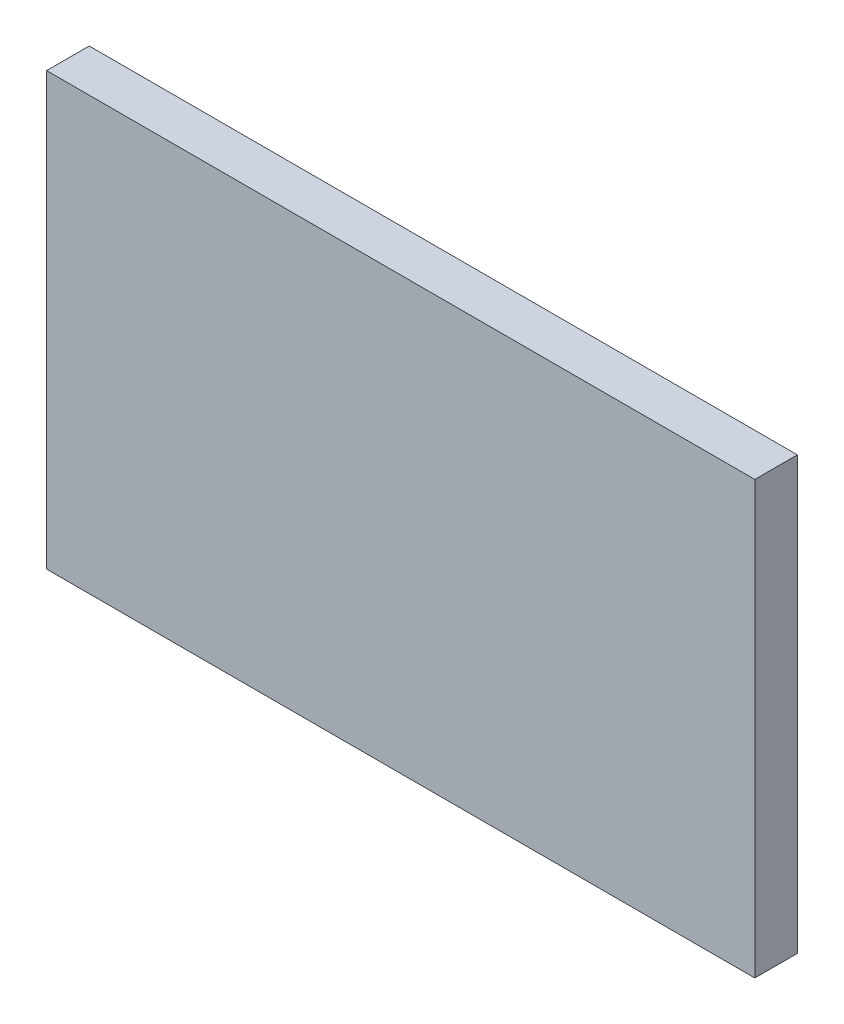
ISO-10303-21;
HEADER;
FILE_DESCRIPTION(('STEP AP214'),'2;1');
FILE_NAME('part.step','',(''),(''),'','','');
FILE_SCHEMA(('AUTOMOTIVE_DESIGN { 1 0 10303 214 1 1 1 1 }'));
ENDSEC;
DATA;
#1=APPLICATION_CONTEXT('core data for automotive mechanical design processes');
#2=APPLICATION_PROTOCOL_DEFINITION('international standard','automotive_design',2000,#1);
#3=PRODUCT_CONTEXT('',#1,'mechanical');
#4=PRODUCT('Part','Part','',(#3));
#5=PRODUCT_RELATED_PRODUCT_CATEGORY('part','',(#4));
#6=PRODUCT_DEFINITION_FORMATION('','',#4);
#7=PRODUCT_DEFINITION_CONTEXT('part definition',#1,'design');
#8=PRODUCT_DEFINITION('design','',#6,#7);
#9=PRODUCT_DEFINITION_SHAPE('','',#8);
#10=(LENGTH_UNIT() NAMED_UNIT(*) SI_UNIT(.MILLI.,.METRE.));
#11=(NAMED_UNIT(*) PLANE_ANGLE_UNIT() SI_UNIT($,.RADIAN.));
#12=(NAMED_UNIT(*) SI_UNIT($,.STERADIAN.) SOLID_ANGLE_UNIT());
#13=UNCERTAINTY_MEASURE_WITH_UNIT(LENGTH_MEASURE(1.E-05),#10,'distance_accuracy_value','');
#14=(GEOMETRIC_REPRESENTATION_CONTEXT(3) GLOBAL_UNCERTAINTY_ASSIGNED_CONTEXT((#13)) GLOBAL_UNIT_ASSIGNED_CONTEXT((#10,
#11,#12)) REPRESENTATION_CONTEXT('',''));
#15=CARTESIAN_POINT('',(0.,0.,0.));
#16=DIRECTION('',(0.,0.,1.));
#17=DIRECTION('',(1.,0.,0.));
#18=AXIS2_PLACEMENT_3D('',#15,#16,#17);
#19=CARTESIAN_POINT('',(0.,0.,10.));
#20=DIRECTION('',(1.,0.,0.));
#21=DIRECTION('',(0.,1.,0.));
#22=AXIS2_PLACEMENT_3D('',#19,#20,#21);
#23=PLANE('',#22);
#24=DIRECTION('',(0.,-1.,0.));
#25=VECTOR('',#24,1.);
#26=CARTESIAN_POINT('',(0.,0.,0.));
#27=LINE('',#26,#25);
#28=CARTESIAN_POINT('',(0.,101.4,0.));
#29=VERTEX_POINT('',#28);
#30=CARTESIAN_POINT('',(0.,0.,0.));
#31=VERTEX_POINT('',#30);
#32=EDGE_CURVE('E98',#29,#31,#27,.T.);
#33=ORIENTED_EDGE('',*,*,#32,.T.);
#34=DIRECTION('',(0.,0.,-1.));
#35=VECTOR('',#34,1.);
#36=CARTESIAN_POINT('',(0.,0.,10.));
#37=LINE('',#36,#35);
#38=CARTESIAN_POINT('',(0.,0.,10.));
#39=VERTEX_POINT('',#38);
#40=EDGE_CURVE('E11',#39,#31,#37,.T.);
#41=ORIENTED_EDGE('',*,*,#40,.F.);
#42=DIRECTION('',(0.,-1.,0.));
#43=VECTOR('',#42,1.);
#44=CARTESIAN_POINT('',(0.,0.,10.));
#45=LINE('',#44,#43);
#46=CARTESIAN_POINT('',(0.,101.4,10.));
#47=VERTEX_POINT('',#46);
#48=EDGE_CURVE('E86',#47,#39,#45,.T.);
#49=ORIENTED_EDGE('',*,*,#48,.F.);
#50=DIRECTION('',(0.,0.,-1.));
#51=VECTOR('',#50,1.);
#52=CARTESIAN_POINT('',(0.,101.4,10.));
#53=LINE('',#52,#51);
#54=EDGE_CURVE('E94',#47,#29,#53,.T.);
#55=ORIENTED_EDGE('',*,*,#54,.T.);
#56=EDGE_LOOP('',(#33,#41,#49,#55));
#57=FACE_BOUND('',#56,.T.);
#58=ADVANCED_FACE('F35',(#57),#23,.F.);
#59=CARTESIAN_POINT('',(0.,0.,10.));
#60=DIRECTION('',(0.,1.,0.));
#61=DIRECTION('',(0.,0.,1.));
#62=AXIS2_PLACEMENT_3D('',#59,#60,#61);
#63=PLANE('',#62);
#64=DIRECTION('',(1.,0.,0.));
#65=VECTOR('',#64,1.);
#66=CARTESIAN_POINT('',(0.,0.,0.));
#67=LINE('',#66,#65);
#68=CARTESIAN_POINT('',(166.3,0.,0.));
#69=VERTEX_POINT('',#68);
#70=EDGE_CURVE('E90',#31,#69,#67,.T.);
#71=ORIENTED_EDGE('',*,*,#70,.T.);
#72=DIRECTION('',(0.,0.,-1.));
#73=VECTOR('',#72,1.);
#74=CARTESIAN_POINT('',(166.3,0.,10.));
#75=LINE('',#74,#73);
#76=CARTESIAN_POINT('',(166.3,0.,10.));
#77=VERTEX_POINT('',#76);
#78=EDGE_CURVE('E43',#77,#69,#75,.T.);
#79=ORIENTED_EDGE('',*,*,#78,.F.);
#80=DIRECTION('',(1.,0.,0.));
#81=VECTOR('',#80,1.);
#82=CARTESIAN_POINT('',(0.,0.,10.));
#83=LINE('',#82,#81);
#84=EDGE_CURVE('E81',#39,#77,#83,.T.);
#85=ORIENTED_EDGE('',*,*,#84,.F.);
#86=ORIENTED_EDGE('',*,*,#40,.T.);
#87=EDGE_LOOP('',(#71,#79,#85,#86));
#88=FACE_BOUND('',#87,.T.);
#89=ADVANCED_FACE('F89',(#88),#63,.F.);
#90=CARTESIAN_POINT('',(166.3,0.,10.));
#91=DIRECTION('',(-1.,0.,0.));
#92=DIRECTION('',(0.,-1.,0.));
#93=AXIS2_PLACEMENT_3D('',#90,#91,#92);
#94=PLANE('',#93);
#95=DIRECTION('',(0.,1.,0.));
#96=VECTOR('',#95,1.);
#97=CARTESIAN_POINT('',(166.3,0.,0.));
#98=LINE('',#97,#96);
#99=CARTESIAN_POINT('',(166.3,101.4,0.));
#100=VERTEX_POINT('',#99);
#101=EDGE_CURVE('E68',#69,#100,#98,.T.);
#102=ORIENTED_EDGE('',*,*,#101,.T.);
#103=DIRECTION('',(0.,0.,-1.));
#104=VECTOR('',#103,1.);
#105=CARTESIAN_POINT('',(166.3,101.4,10.));
#106=LINE('',#105,#104);
#107=CARTESIAN_POINT('',(166.3,101.4,10.));
#108=VERTEX_POINT('',#107);
#109=EDGE_CURVE('E91',#108,#100,#106,.T.);
#110=ORIENTED_EDGE('',*,*,#109,.F.);
#111=DIRECTION('',(0.,1.,0.));
#112=VECTOR('',#111,1.);
#113=CARTESIAN_POINT('',(166.3,0.,10.));
#114=LINE('',#113,#112);
#115=EDGE_CURVE('E84',#77,#108,#114,.T.);
#116=ORIENTED_EDGE('',*,*,#115,.F.);
#117=ORIENTED_EDGE('',*,*,#78,.T.);
#118=EDGE_LOOP('',(#102,#110,#116,#117));
#119=FACE_BOUND('',#118,.T.);
#120=ADVANCED_FACE('F92',(#119),#94,.F.);
#121=CARTESIAN_POINT('',(0.,101.4,10.));
#122=DIRECTION('',(0.,-1.,0.));
#123=DIRECTION('',(0.,0.,-1.));
#124=AXIS2_PLACEMENT_3D('',#121,#122,#123);
#125=PLANE('',#124);
#126=DIRECTION('',(-1.,0.,0.));
#127=VECTOR('',#126,1.);
#128=CARTESIAN_POINT('',(0.,101.4,0.));
#129=LINE('',#128,#127);
#130=EDGE_CURVE('E74',#100,#29,#129,.T.);
#131=ORIENTED_EDGE('',*,*,#130,.T.);
#132=ORIENTED_EDGE('',*,*,#54,.F.);
#133=DIRECTION('',(-1.,0.,0.));
#134=VECTOR('',#133,1.);
#135=CARTESIAN_POINT('',(0.,101.4,10.));
#136=LINE('',#135,#134);
#137=EDGE_CURVE('E51',#108,#47,#136,.T.);
#138=ORIENTED_EDGE('',*,*,#137,.F.);
#139=ORIENTED_EDGE('',*,*,#109,.T.);
#140=EDGE_LOOP('',(#131,#132,#138,#139));
#141=FACE_BOUND('',#140,.T.);
#142=ADVANCED_FACE('F105',(#141),#125,.F.);
#143=CARTESIAN_POINT('',(0.,0.,10.));
#144=DIRECTION('',(0.,0.,-1.));
#145=DIRECTION('',(-1.,0.,0.));
#146=AXIS2_PLACEMENT_3D('',#143,#144,#145);
#147=PLANE('',#146);
#148=ORIENTED_EDGE('',*,*,#48,.T.);
#149=ORIENTED_EDGE('',*,*,#84,.T.);
#150=ORIENTED_EDGE('',*,*,#115,.T.);
#151=ORIENTED_EDGE('',*,*,#137,.T.);
#152=EDGE_LOOP('',(#148,#149,#150,#151));
#153=FACE_BOUND('',#152,.T.);
#154=ADVANCED_FACE('F82',(#153),#147,.F.);
#155=CARTESIAN_POINT('',(0.,0.,0.));
#156=DIRECTION('',(0.,0.,-1.));
#157=DIRECTION('',(-1.,0.,0.));
#158=AXIS2_PLACEMENT_3D('',#155,#156,#157);
#159=PLANE('',#158);
#160=ORIENTED_EDGE('',*,*,#32,.F.);
#161=ORIENTED_EDGE('',*,*,#130,.F.);
#162=ORIENTED_EDGE('',*,*,#101,.F.);
#163=ORIENTED_EDGE('',*,*,#70,.F.);
#164=EDGE_LOOP('',(#160,#161,#162,#163));
#165=FACE_BOUND('',#164,.T.);
#166=ADVANCED_FACE('F108',(#165),#159,.T.);
#167=CLOSED_SHELL('',(#58,#89,#120,#142,#154,#166));
#168=MANIFOLD_SOLID_BREP('B2',#167);
#169=ADVANCED_BREP_SHAPE_REPRESENTATION('',(#18,#168),#14);
#170=SHAPE_DEFINITION_REPRESENTATION(#9,#169);
ENDSEC;
END-ISO-10303-21;
